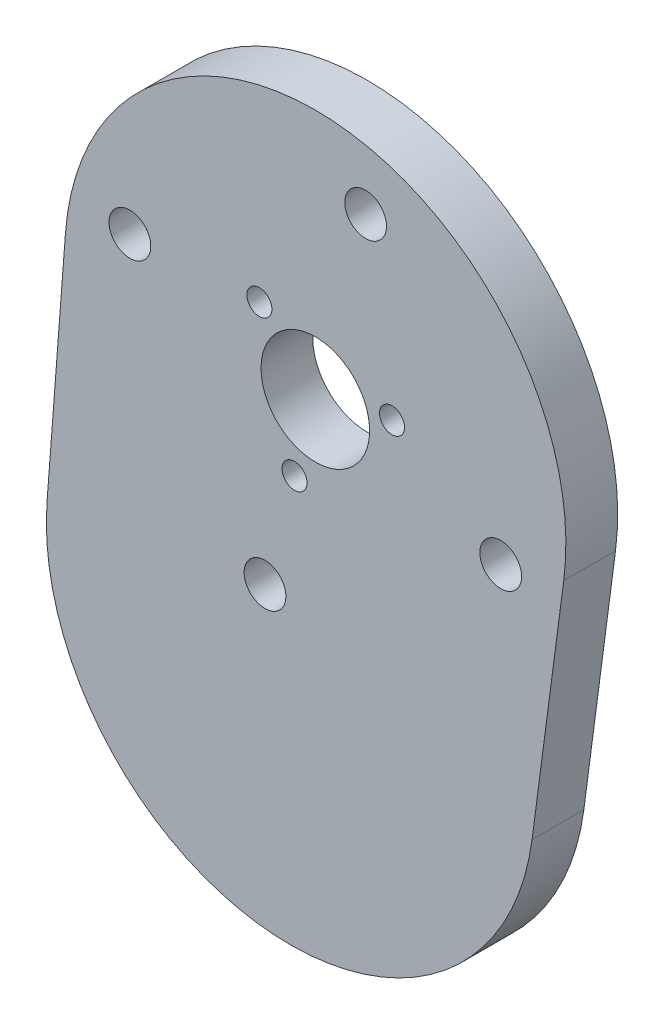
ISO-10303-21;
HEADER;
FILE_DESCRIPTION(('STEP AP214'),'2;1');
FILE_NAME('part.step','',(''),(''),'','','');
FILE_SCHEMA(('AUTOMOTIVE_DESIGN { 1 0 10303 214 1 1 1 1 }'));
ENDSEC;
DATA;
#1=APPLICATION_CONTEXT('core data for automotive mechanical design processes');
#2=APPLICATION_PROTOCOL_DEFINITION('international standard','automotive_design',2000,#1);
#3=PRODUCT_CONTEXT('',#1,'mechanical');
#4=PRODUCT('Part','Part','',(#3));
#5=PRODUCT_RELATED_PRODUCT_CATEGORY('part','',(#4));
#6=PRODUCT_DEFINITION_FORMATION('','',#4);
#7=PRODUCT_DEFINITION_CONTEXT('part definition',#1,'design');
#8=PRODUCT_DEFINITION('design','',#6,#7);
#9=PRODUCT_DEFINITION_SHAPE('','',#8);
#10=(LENGTH_UNIT() NAMED_UNIT(*) SI_UNIT(.MILLI.,.METRE.));
#11=(NAMED_UNIT(*) PLANE_ANGLE_UNIT() SI_UNIT($,.RADIAN.));
#12=(NAMED_UNIT(*) SI_UNIT($,.STERADIAN.) SOLID_ANGLE_UNIT());
#13=UNCERTAINTY_MEASURE_WITH_UNIT(LENGTH_MEASURE(1.E-05),#10,'distance_accuracy_value','');
#14=(GEOMETRIC_REPRESENTATION_CONTEXT(3) GLOBAL_UNCERTAINTY_ASSIGNED_CONTEXT((#13)) GLOBAL_UNIT_ASSIGNED_CONTEXT((#10,
#11,#12)) REPRESENTATION_CONTEXT('',''));
#15=CARTESIAN_POINT('',(0.,0.,0.));
#16=DIRECTION('',(0.,0.,1.));
#17=DIRECTION('',(1.,0.,0.));
#18=AXIS2_PLACEMENT_3D('',#15,#16,#17);
#19=CARTESIAN_POINT('',(29.7420767723274,-3.92541326091705,6.2));
#20=DIRECTION('',(-0.99140255907758,0.130847108697235,0.));
#21=DIRECTION('',(-0.130847108697235,-0.99140255907758,0.));
#22=AXIS2_PLACEMENT_3D('',#19,#20,#21);
#23=PLANE('',#22);
#24=DIRECTION('',(0.130847108697235,0.99140255907758,0.));
#25=VECTOR('',#24,1.);
#26=CARTESIAN_POINT('',(29.7420767723274,-3.92541326091705,0.));
#27=LINE('',#26,#25);
#28=CARTESIAN_POINT('',(25.9489547250653,-32.6651457776712,0.));
#29=VERTEX_POINT('',#28);
#30=CARTESIAN_POINT('',(29.7420767723274,-3.92541326091706,0.));
#31=VERTEX_POINT('',#30);
#32=EDGE_CURVE('E114',#29,#31,#27,.T.);
#33=ORIENTED_EDGE('',*,*,#32,.T.);
#34=DIRECTION('',(0.,0.,-1.));
#35=VECTOR('',#34,1.);
#36=CARTESIAN_POINT('',(29.7420767723274,-3.92541326091706,6.2));
#37=LINE('',#36,#35);
#38=CARTESIAN_POINT('',(29.7420767723274,-3.92541326091706,6.2));
#39=VERTEX_POINT('',#38);
#40=EDGE_CURVE('E11',#39,#31,#37,.T.);
#41=ORIENTED_EDGE('',*,*,#40,.F.);
#42=DIRECTION('',(0.130847108697235,0.99140255907758,0.));
#43=VECTOR('',#42,1.);
#44=CARTESIAN_POINT('',(29.7420767723274,-3.92541326091705,6.2));
#45=LINE('',#44,#43);
#46=CARTESIAN_POINT('',(25.9489547250653,-32.6651457776712,6.2));
#47=VERTEX_POINT('',#46);
#48=EDGE_CURVE('E86',#47,#39,#45,.T.);
#49=ORIENTED_EDGE('',*,*,#48,.F.);
#50=DIRECTION('',(0.,0.,-1.));
#51=VECTOR('',#50,1.);
#52=CARTESIAN_POINT('',(25.9489547250653,-32.6651457776712,6.2));
#53=LINE('',#52,#51);
#54=EDGE_CURVE('E94',#47,#29,#53,.T.);
#55=ORIENTED_EDGE('',*,*,#54,.T.);
#56=EDGE_LOOP('',(#33,#41,#49,#55));
#57=FACE_BOUND('',#56,.T.);
#58=ADVANCED_FACE('F34',(#57),#23,.F.);
#59=CARTESIAN_POINT('',(0.,0.,6.2));
#60=DIRECTION('',(0.,0.,-1.));
#61=DIRECTION('',(-1.,0.,0.));
#62=AXIS2_PLACEMENT_3D('',#59,#60,#61);
#63=CYLINDRICAL_SURFACE('',#62,30.);
#64=CARTESIAN_POINT('',(0.,0.,0.));
#65=DIRECTION('',(0.,0.,1.));
#66=DIRECTION('',(1.,0.,0.));
#67=AXIS2_PLACEMENT_3D('',#64,#65,#66);
#68=CIRCLE('',#67,30.);
#69=CARTESIAN_POINT('',(-29.9133015047887,2.27912112087167,0.));
#70=VERTEX_POINT('',#69);
#71=EDGE_CURVE('E90',#31,#70,#68,.T.);
#72=ORIENTED_EDGE('',*,*,#71,.T.);
#73=DIRECTION('',(0.,0.,-1.));
#74=VECTOR('',#73,1.);
#75=CARTESIAN_POINT('',(-29.9133015047887,2.27912112087167,6.2));
#76=LINE('',#75,#74);
#77=CARTESIAN_POINT('',(-29.9133015047887,2.27912112087167,6.2));
#78=VERTEX_POINT('',#77);
#79=EDGE_CURVE('E43',#78,#70,#76,.T.);
#80=ORIENTED_EDGE('',*,*,#79,.F.);
#81=CARTESIAN_POINT('',(0.,0.,6.2));
#82=DIRECTION('',(0.,0.,1.));
#83=DIRECTION('',(1.,0.,0.));
#84=AXIS2_PLACEMENT_3D('',#81,#82,#83);
#85=CIRCLE('',#84,30.);
#86=EDGE_CURVE('E81',#39,#78,#85,.T.);
#87=ORIENTED_EDGE('',*,*,#86,.F.);
#88=ORIENTED_EDGE('',*,*,#40,.T.);
#89=EDGE_LOOP('',(#72,#80,#87,#88));
#90=FACE_BOUND('',#89,.T.);
#91=ADVANCED_FACE('F89',(#90),#63,.T.);
#92=CARTESIAN_POINT('',(-29.9133015047887,2.27912112087167,6.2));
#93=DIRECTION('',(0.997110050159625,-0.0759707040290557,0.));
#94=DIRECTION('',(0.0759707040290557,0.997110050159625,0.));
#95=AXIS2_PLACEMENT_3D('',#92,#93,#94);
#96=PLANE('',#95);
#97=DIRECTION('',(-0.0759707040290557,-0.997110050159625,0.));
#98=VECTOR('',#97,1.);
#99=CARTESIAN_POINT('',(-29.9133015047887,2.27912112087167,0.));
#100=LINE('',#99,#98);
#101=CARTESIAN_POINT('',(-32.115613464661,-26.6260656460635,0.));
#102=VERTEX_POINT('',#101);
#103=EDGE_CURVE('E68',#70,#102,#100,.T.);
#104=ORIENTED_EDGE('',*,*,#103,.T.);
#105=DIRECTION('',(0.,0.,-1.));
#106=VECTOR('',#105,1.);
#107=CARTESIAN_POINT('',(-32.115613464661,-26.6260656460635,6.2));
#108=LINE('',#107,#106);
#109=CARTESIAN_POINT('',(-32.115613464661,-26.6260656460635,6.2));
#110=VERTEX_POINT('',#109);
#111=EDGE_CURVE('E91',#110,#102,#108,.T.);
#112=ORIENTED_EDGE('',*,*,#111,.F.);
#113=DIRECTION('',(-0.0759707040290557,-0.997110050159625,0.));
#114=VECTOR('',#113,1.);
#115=CARTESIAN_POINT('',(-29.9133015047887,2.27912112087167,6.2));
#116=LINE('',#115,#114);
#117=EDGE_CURVE('E84',#78,#110,#116,.T.);
#118=ORIENTED_EDGE('',*,*,#117,.F.);
#119=ORIENTED_EDGE('',*,*,#79,.T.);
#120=EDGE_LOOP('',(#104,#112,#118,#119));
#121=FACE_BOUND('',#120,.T.);
#122=ADVANCED_FACE('F92',(#121),#96,.F.);
#123=CARTESIAN_POINT('',(0.,0.,6.2));
#124=DIRECTION('',(0.,0.,-1.));
#125=DIRECTION('',(-1.,0.,0.));
#126=AXIS2_PLACEMENT_3D('',#123,#124,#125);
#127=CYLINDRICAL_SURFACE('',#126,6.5);
#128=CARTESIAN_POINT('',(0.,0.,6.2));
#129=DIRECTION('',(0.,0.,1.));
#130=DIRECTION('',(1.,0.,0.));
#131=AXIS2_PLACEMENT_3D('',#128,#129,#130);
#132=CIRCLE('',#131,6.5);
#133=CARTESIAN_POINT('',(-6.5,0.,6.2));
#134=VERTEX_POINT('',#133);
#135=EDGE_CURVE('E127',#134,#134,#132,.T.);
#136=CARTESIAN_POINT('',(0.,0.,0.));
#137=DIRECTION('',(0.,0.,1.));
#138=DIRECTION('',(1.,0.,0.));
#139=AXIS2_PLACEMENT_3D('',#136,#137,#138);
#140=CIRCLE('',#139,6.5);
#141=CARTESIAN_POINT('',(-6.5,0.,0.));
#142=VERTEX_POINT('',#141);
#143=EDGE_CURVE('E111',#142,#142,#140,.T.);
#144=CARTESIAN_POINT('',(-6.5,0.,6.2));
#145=CARTESIAN_POINT('',(-6.5,0.,6.13541666666667));
#146=CARTESIAN_POINT('',(-6.5,0.,6.07083333333333));
#147=CARTESIAN_POINT('',(-6.5,0.,5.94166666666667));
#148=CARTESIAN_POINT('',(-6.5,0.,5.87708333333333));
#149=CARTESIAN_POINT('',(-6.5,0.,5.74791666666667));
#150=CARTESIAN_POINT('',(-6.5,0.,5.68333333333333));
#151=CARTESIAN_POINT('',(-6.5,0.,5.55416666666667));
#152=CARTESIAN_POINT('',(-6.5,0.,5.48958333333333));
#153=CARTESIAN_POINT('',(-6.5,0.,5.36041666666667));
#154=CARTESIAN_POINT('',(-6.5,0.,5.29583333333333));
#155=CARTESIAN_POINT('',(-6.5,0.,5.16666666666667));
#156=CARTESIAN_POINT('',(-6.5,0.,5.10208333333333));
#157=CARTESIAN_POINT('',(-6.5,0.,4.97291666666667));
#158=CARTESIAN_POINT('',(-6.5,0.,4.90833333333333));
#159=CARTESIAN_POINT('',(-6.5,0.,4.77916666666667));
#160=CARTESIAN_POINT('',(-6.5,0.,4.71458333333333));
#161=CARTESIAN_POINT('',(-6.5,0.,4.58541666666667));
#162=CARTESIAN_POINT('',(-6.5,0.,4.52083333333333));
#163=CARTESIAN_POINT('',(-6.5,0.,4.39166666666667));
#164=CARTESIAN_POINT('',(-6.5,0.,4.32708333333333));
#165=CARTESIAN_POINT('',(-6.5,0.,4.19791666666667));
#166=CARTESIAN_POINT('',(-6.5,0.,4.13333333333333));
#167=CARTESIAN_POINT('',(-6.5,0.,4.00416666666667));
#168=CARTESIAN_POINT('',(-6.5,0.,3.93958333333333));
#169=CARTESIAN_POINT('',(-6.5,0.,3.81041666666667));
#170=CARTESIAN_POINT('',(-6.5,0.,3.74583333333333));
#171=CARTESIAN_POINT('',(-6.5,0.,3.61666666666667));
#172=CARTESIAN_POINT('',(-6.5,0.,3.55208333333333));
#173=CARTESIAN_POINT('',(-6.5,0.,3.42291666666667));
#174=CARTESIAN_POINT('',(-6.5,0.,3.35833333333333));
#175=CARTESIAN_POINT('',(-6.5,0.,3.22916666666667));
#176=CARTESIAN_POINT('',(-6.5,0.,3.16458333333333));
#177=CARTESIAN_POINT('',(-6.5,0.,3.03541666666667));
#178=CARTESIAN_POINT('',(-6.5,0.,2.97083333333333));
#179=CARTESIAN_POINT('',(-6.5,0.,2.84166666666667));
#180=CARTESIAN_POINT('',(-6.5,0.,2.77708333333333));
#181=CARTESIAN_POINT('',(-6.5,0.,2.64791666666667));
#182=CARTESIAN_POINT('',(-6.5,0.,2.58333333333333));
#183=CARTESIAN_POINT('',(-6.5,0.,2.45416666666667));
#184=CARTESIAN_POINT('',(-6.5,0.,2.38958333333333));
#185=CARTESIAN_POINT('',(-6.5,0.,2.26041666666667));
#186=CARTESIAN_POINT('',(-6.5,0.,2.19583333333333));
#187=CARTESIAN_POINT('',(-6.5,0.,2.06666666666667));
#188=CARTESIAN_POINT('',(-6.5,0.,2.00208333333333));
#189=CARTESIAN_POINT('',(-6.5,0.,1.87291666666667));
#190=CARTESIAN_POINT('',(-6.5,0.,1.80833333333333));
#191=CARTESIAN_POINT('',(-6.5,0.,1.67916666666667));
#192=CARTESIAN_POINT('',(-6.5,0.,1.61458333333333));
#193=CARTESIAN_POINT('',(-6.5,0.,1.48541666666667));
#194=CARTESIAN_POINT('',(-6.5,0.,1.42083333333333));
#195=CARTESIAN_POINT('',(-6.5,0.,1.29166666666667));
#196=CARTESIAN_POINT('',(-6.5,0.,1.22708333333333));
#197=CARTESIAN_POINT('',(-6.5,0.,1.09791666666667));
#198=CARTESIAN_POINT('',(-6.5,0.,1.03333333333333));
#199=CARTESIAN_POINT('',(-6.5,0.,0.904166666666667));
#200=CARTESIAN_POINT('',(-6.5,0.,0.839583333333333));
#201=CARTESIAN_POINT('',(-6.5,0.,0.710416666666666));
#202=CARTESIAN_POINT('',(-6.5,0.,0.645833333333333));
#203=CARTESIAN_POINT('',(-6.5,0.,0.516666666666667));
#204=CARTESIAN_POINT('',(-6.5,0.,0.452083333333333));
#205=CARTESIAN_POINT('',(-6.5,0.,0.322916666666667));
#206=CARTESIAN_POINT('',(-6.5,0.,0.258333333333334));
#207=CARTESIAN_POINT('',(-6.5,0.,0.129166666666667));
#208=CARTESIAN_POINT('',(-6.5,0.,0.0645833333333335));
#209=CARTESIAN_POINT('',(-6.5,0.,0.));
#210=B_SPLINE_CURVE_WITH_KNOTS('',3,(#144,#145,#146,#147,#148,#149,#150,#151,#152,#153,#154,
#155,#156,#157,#158,#159,#160,#161,#162,#163,#164,#165,#166,#167,#168,#169,#170,#171,#172,#173,
#174,#175,#176,#177,#178,#179,#180,#181,#182,#183,#184,#185,#186,#187,#188,#189,#190,#191,#192,
#193,#194,#195,#196,#197,#198,#199,#200,#201,#202,#203,#204,#205,#206,#207,#208,#209),
.UNSPECIFIED.,.F.,.F.,(4,2,2,2,2,2,2,2,2,2,2,2,2,2,2,2,2,2,2,2,2,2,2,2,2,2,2,2,2,2,2,2,4),(0.,
0.193749999999999,0.3875,0.581249999999999,0.775,0.968749999999999,1.1625,1.35625,1.55,1.74375,
1.9375,2.13125,2.325,2.51875,2.7125,2.90625,3.1,3.29375,3.4875,3.68125,3.875,4.06875,4.2625,
4.45625,4.65,4.84375,5.0375,5.23125,5.425,5.61875,5.8125,6.00625,6.2),.UNSPECIFIED.);
#211=EDGE_CURVE('BSEAM180',#134,#142,#210,.T.);
#212=ORIENTED_EDGE('',*,*,#135,.T.);
#213=ORIENTED_EDGE('',*,*,#143,.F.);
#214=ORIENTED_EDGE('',*,*,#211,.T.);
#215=ORIENTED_EDGE('',*,*,#211,.F.);
#216=EDGE_LOOP('',(#212,#214,#213,#215));
#217=FACE_BOUND('',#216,.T.);
#218=ADVANCED_FACE('F180',(#217),#127,.F.);
#219=CARTESIAN_POINT('',(-6.02438579438068,-22.1969992521616,6.2));
#220=DIRECTION('',(0.,0.,-1.));
#221=DIRECTION('',(-1.,0.,0.));
#222=AXIS2_PLACEMENT_3D('',#219,#220,#221);
#223=CYLINDRICAL_SURFACE('',#222,2.5);
#224=CARTESIAN_POINT('',(-6.02438579438068,-22.1969992521616,6.2));
#225=DIRECTION('',(0.,0.,1.));
#226=DIRECTION('',(1.,0.,0.));
#227=AXIS2_PLACEMENT_3D('',#224,#225,#226);
#228=CIRCLE('',#227,2.5);
#229=CARTESIAN_POINT('',(-8.52438579438068,-22.1969992521616,6.2));
#230=VERTEX_POINT('',#229);
#231=EDGE_CURVE('E129',#230,#230,#228,.T.);
#232=CARTESIAN_POINT('',(-6.02438579438068,-22.1969992521616,0.));
#233=DIRECTION('',(0.,0.,1.));
#234=DIRECTION('',(1.,0.,0.));
#235=AXIS2_PLACEMENT_3D('',#232,#233,#234);
#236=CIRCLE('',#235,2.5);
#237=CARTESIAN_POINT('',(-8.52438579438068,-22.1969992521616,0.));
#238=VERTEX_POINT('',#237);
#239=EDGE_CURVE('E108',#238,#238,#236,.T.);
#240=CARTESIAN_POINT('',(-8.52438579438068,-22.1969992521616,6.2));
#241=CARTESIAN_POINT('',(-8.52438579438068,-22.1969992521616,6.13541666666667));
#242=CARTESIAN_POINT('',(-8.52438579438068,-22.1969992521616,6.07083333333333));
#243=CARTESIAN_POINT('',(-8.52438579438068,-22.1969992521616,5.94166666666667));
#244=CARTESIAN_POINT('',(-8.52438579438068,-22.1969992521616,5.87708333333333));
#245=CARTESIAN_POINT('',(-8.52438579438068,-22.1969992521616,5.74791666666667));
#246=CARTESIAN_POINT('',(-8.52438579438068,-22.1969992521616,5.68333333333333));
#247=CARTESIAN_POINT('',(-8.52438579438068,-22.1969992521616,5.55416666666667));
#248=CARTESIAN_POINT('',(-8.52438579438068,-22.1969992521616,5.48958333333333));
#249=CARTESIAN_POINT('',(-8.52438579438068,-22.1969992521616,5.36041666666667));
#250=CARTESIAN_POINT('',(-8.52438579438068,-22.1969992521616,5.29583333333333));
#251=CARTESIAN_POINT('',(-8.52438579438068,-22.1969992521616,5.16666666666667));
#252=CARTESIAN_POINT('',(-8.52438579438068,-22.1969992521616,5.10208333333333));
#253=CARTESIAN_POINT('',(-8.52438579438068,-22.1969992521616,4.97291666666667));
#254=CARTESIAN_POINT('',(-8.52438579438068,-22.1969992521616,4.90833333333333));
#255=CARTESIAN_POINT('',(-8.52438579438068,-22.1969992521616,4.77916666666667));
#256=CARTESIAN_POINT('',(-8.52438579438068,-22.1969992521616,4.71458333333333));
#257=CARTESIAN_POINT('',(-8.52438579438068,-22.1969992521616,4.58541666666667));
#258=CARTESIAN_POINT('',(-8.52438579438068,-22.1969992521616,4.52083333333333));
#259=CARTESIAN_POINT('',(-8.52438579438068,-22.1969992521616,4.39166666666667));
#260=CARTESIAN_POINT('',(-8.52438579438068,-22.1969992521616,4.32708333333333));
#261=CARTESIAN_POINT('',(-8.52438579438068,-22.1969992521616,4.19791666666667));
#262=CARTESIAN_POINT('',(-8.52438579438068,-22.1969992521616,4.13333333333333));
#263=CARTESIAN_POINT('',(-8.52438579438068,-22.1969992521616,4.00416666666667));
#264=CARTESIAN_POINT('',(-8.52438579438068,-22.1969992521616,3.93958333333333));
#265=CARTESIAN_POINT('',(-8.52438579438068,-22.1969992521616,3.81041666666667));
#266=CARTESIAN_POINT('',(-8.52438579438068,-22.1969992521616,3.74583333333333));
#267=CARTESIAN_POINT('',(-8.52438579438068,-22.1969992521616,3.61666666666667));
#268=CARTESIAN_POINT('',(-8.52438579438068,-22.1969992521616,3.55208333333333));
#269=CARTESIAN_POINT('',(-8.52438579438068,-22.1969992521616,3.42291666666667));
#270=CARTESIAN_POINT('',(-8.52438579438068,-22.1969992521616,3.35833333333333));
#271=CARTESIAN_POINT('',(-8.52438579438068,-22.1969992521616,3.22916666666667));
#272=CARTESIAN_POINT('',(-8.52438579438068,-22.1969992521616,3.16458333333333));
#273=CARTESIAN_POINT('',(-8.52438579438068,-22.1969992521616,3.03541666666667));
#274=CARTESIAN_POINT('',(-8.52438579438068,-22.1969992521616,2.97083333333333));
#275=CARTESIAN_POINT('',(-8.52438579438068,-22.1969992521616,2.84166666666667));
#276=CARTESIAN_POINT('',(-8.52438579438068,-22.1969992521616,2.77708333333333));
#277=CARTESIAN_POINT('',(-8.52438579438068,-22.1969992521616,2.64791666666667));
#278=CARTESIAN_POINT('',(-8.52438579438068,-22.1969992521616,2.58333333333333));
#279=CARTESIAN_POINT('',(-8.52438579438068,-22.1969992521616,2.45416666666667));
#280=CARTESIAN_POINT('',(-8.52438579438068,-22.1969992521616,2.38958333333333));
#281=CARTESIAN_POINT('',(-8.52438579438068,-22.1969992521616,2.26041666666667));
#282=CARTESIAN_POINT('',(-8.52438579438068,-22.1969992521616,2.19583333333333));
#283=CARTESIAN_POINT('',(-8.52438579438068,-22.1969992521616,2.06666666666667));
#284=CARTESIAN_POINT('',(-8.52438579438068,-22.1969992521616,2.00208333333333));
#285=CARTESIAN_POINT('',(-8.52438579438068,-22.1969992521616,1.87291666666667));
#286=CARTESIAN_POINT('',(-8.52438579438068,-22.1969992521616,1.80833333333333));
#287=CARTESIAN_POINT('',(-8.52438579438068,-22.1969992521616,1.67916666666667));
#288=CARTESIAN_POINT('',(-8.52438579438068,-22.1969992521616,1.61458333333333));
#289=CARTESIAN_POINT('',(-8.52438579438068,-22.1969992521616,1.48541666666667));
#290=CARTESIAN_POINT('',(-8.52438579438068,-22.1969992521616,1.42083333333333));
#291=CARTESIAN_POINT('',(-8.52438579438068,-22.1969992521616,1.29166666666667));
#292=CARTESIAN_POINT('',(-8.52438579438068,-22.1969992521616,1.22708333333333));
#293=CARTESIAN_POINT('',(-8.52438579438068,-22.1969992521616,1.09791666666667));
#294=CARTESIAN_POINT('',(-8.52438579438068,-22.1969992521616,1.03333333333333));
#295=CARTESIAN_POINT('',(-8.52438579438068,-22.1969992521616,0.904166666666667));
#296=CARTESIAN_POINT('',(-8.52438579438068,-22.1969992521616,0.839583333333333));
#297=CARTESIAN_POINT('',(-8.52438579438068,-22.1969992521616,0.710416666666666));
#298=CARTESIAN_POINT('',(-8.52438579438068,-22.1969992521616,0.645833333333333));
#299=CARTESIAN_POINT('',(-8.52438579438068,-22.1969992521616,0.516666666666667));
#300=CARTESIAN_POINT('',(-8.52438579438068,-22.1969992521616,0.452083333333333));
#301=CARTESIAN_POINT('',(-8.52438579438068,-22.1969992521616,0.322916666666667));
#302=CARTESIAN_POINT('',(-8.52438579438068,-22.1969992521616,0.258333333333334));
#303=CARTESIAN_POINT('',(-8.52438579438068,-22.1969992521616,0.129166666666667));
#304=CARTESIAN_POINT('',(-8.52438579438068,-22.1969992521616,0.0645833333333335));
#305=CARTESIAN_POINT('',(-8.52438579438068,-22.1969992521616,0.));
#306=B_SPLINE_CURVE_WITH_KNOTS('',3,(#240,#241,#242,#243,#244,#245,#246,#247,#248,#249,#250,
#251,#252,#253,#254,#255,#256,#257,#258,#259,#260,#261,#262,#263,#264,#265,#266,#267,#268,#269,
#270,#271,#272,#273,#274,#275,#276,#277,#278,#279,#280,#281,#282,#283,#284,#285,#286,#287,#288,
#289,#290,#291,#292,#293,#294,#295,#296,#297,#298,#299,#300,#301,#302,#303,#304,#305),
.UNSPECIFIED.,.F.,.F.,(4,2,2,2,2,2,2,2,2,2,2,2,2,2,2,2,2,2,2,2,2,2,2,2,2,2,2,2,2,2,2,2,4),(0.,
0.193749999999999,0.3875,0.581249999999999,0.775,0.968749999999999,1.1625,1.35625,1.55,1.74375,
1.9375,2.13125,2.325,2.51875,2.7125,2.90625,3.1,3.29375,3.4875,3.68125,3.875,4.06875,4.2625,
4.45625,4.65,4.84375,5.0375,5.23125,5.425,5.61875,5.8125,6.00625,6.2),.UNSPECIFIED.);
#307=EDGE_CURVE('BSEAM183',#230,#238,#306,.T.);
#308=ORIENTED_EDGE('',*,*,#231,.T.);
#309=ORIENTED_EDGE('',*,*,#239,.F.);
#310=ORIENTED_EDGE('',*,*,#307,.T.);
#311=ORIENTED_EDGE('',*,*,#307,.F.);
#312=EDGE_LOOP('',(#308,#310,#309,#311));
#313=FACE_BOUND('',#312,.T.);
#314=ADVANCED_FACE('F183',(#313),#223,.F.);
#315=CARTESIAN_POINT('',(6.02438579437938,22.1969992521624,6.2));
#316=DIRECTION('',(0.,0.,-1.));
#317=DIRECTION('',(-1.,0.,0.));
#318=AXIS2_PLACEMENT_3D('',#315,#316,#317);
#319=CYLINDRICAL_SURFACE('',#318,2.49999999999791);
#320=CARTESIAN_POINT('',(6.02438579437938,22.1969992521624,6.2));
#321=DIRECTION('',(0.,0.,1.));
#322=DIRECTION('',(1.,0.,0.));
#323=AXIS2_PLACEMENT_3D('',#320,#321,#322);
#324=CIRCLE('',#323,2.49999999999791);
#325=CARTESIAN_POINT('',(3.52438579438147,22.1969992521624,6.2));
#326=VERTEX_POINT('',#325);
#327=EDGE_CURVE('E134',#326,#326,#324,.T.);
#328=CARTESIAN_POINT('',(6.02438579437938,22.1969992521624,0.));
#329=DIRECTION('',(0.,0.,1.));
#330=DIRECTION('',(1.,0.,0.));
#331=AXIS2_PLACEMENT_3D('',#328,#329,#330);
#332=CIRCLE('',#331,2.49999999999791);
#333=CARTESIAN_POINT('',(3.52438579438147,22.1969992521624,0.));
#334=VERTEX_POINT('',#333);
#335=EDGE_CURVE('E105',#334,#334,#332,.T.);
#336=CARTESIAN_POINT('',(3.52438579438147,22.1969992521624,6.2));
#337=CARTESIAN_POINT('',(3.52438579438147,22.1969992521624,6.13541666666667));
#338=CARTESIAN_POINT('',(3.52438579438147,22.1969992521624,6.07083333333333));
#339=CARTESIAN_POINT('',(3.52438579438147,22.1969992521624,5.94166666666667));
#340=CARTESIAN_POINT('',(3.52438579438147,22.1969992521624,5.87708333333333));
#341=CARTESIAN_POINT('',(3.52438579438147,22.1969992521624,5.74791666666667));
#342=CARTESIAN_POINT('',(3.52438579438147,22.1969992521624,5.68333333333333));
#343=CARTESIAN_POINT('',(3.52438579438147,22.1969992521624,5.55416666666667));
#344=CARTESIAN_POINT('',(3.52438579438147,22.1969992521624,5.48958333333333));
#345=CARTESIAN_POINT('',(3.52438579438147,22.1969992521624,5.36041666666667));
#346=CARTESIAN_POINT('',(3.52438579438147,22.1969992521624,5.29583333333333));
#347=CARTESIAN_POINT('',(3.52438579438147,22.1969992521624,5.16666666666667));
#348=CARTESIAN_POINT('',(3.52438579438147,22.1969992521624,5.10208333333333));
#349=CARTESIAN_POINT('',(3.52438579438147,22.1969992521624,4.97291666666667));
#350=CARTESIAN_POINT('',(3.52438579438147,22.1969992521624,4.90833333333333));
#351=CARTESIAN_POINT('',(3.52438579438147,22.1969992521624,4.77916666666667));
#352=CARTESIAN_POINT('',(3.52438579438147,22.1969992521624,4.71458333333333));
#353=CARTESIAN_POINT('',(3.52438579438147,22.1969992521624,4.58541666666667));
#354=CARTESIAN_POINT('',(3.52438579438147,22.1969992521624,4.52083333333333));
#355=CARTESIAN_POINT('',(3.52438579438147,22.1969992521624,4.39166666666667));
#356=CARTESIAN_POINT('',(3.52438579438147,22.1969992521624,4.32708333333333));
#357=CARTESIAN_POINT('',(3.52438579438147,22.1969992521624,4.19791666666667));
#358=CARTESIAN_POINT('',(3.52438579438147,22.1969992521624,4.13333333333333));
#359=CARTESIAN_POINT('',(3.52438579438147,22.1969992521624,4.00416666666667));
#360=CARTESIAN_POINT('',(3.52438579438147,22.1969992521624,3.93958333333333));
#361=CARTESIAN_POINT('',(3.52438579438147,22.1969992521624,3.81041666666667));
#362=CARTESIAN_POINT('',(3.52438579438147,22.1969992521624,3.74583333333333));
#363=CARTESIAN_POINT('',(3.52438579438147,22.1969992521624,3.61666666666667));
#364=CARTESIAN_POINT('',(3.52438579438147,22.1969992521624,3.55208333333333));
#365=CARTESIAN_POINT('',(3.52438579438147,22.1969992521624,3.42291666666667));
#366=CARTESIAN_POINT('',(3.52438579438147,22.1969992521624,3.35833333333333));
#367=CARTESIAN_POINT('',(3.52438579438147,22.1969992521624,3.22916666666667));
#368=CARTESIAN_POINT('',(3.52438579438147,22.1969992521624,3.16458333333333));
#369=CARTESIAN_POINT('',(3.52438579438147,22.1969992521624,3.03541666666667));
#370=CARTESIAN_POINT('',(3.52438579438147,22.1969992521624,2.97083333333333));
#371=CARTESIAN_POINT('',(3.52438579438147,22.1969992521624,2.84166666666667));
#372=CARTESIAN_POINT('',(3.52438579438147,22.1969992521624,2.77708333333333));
#373=CARTESIAN_POINT('',(3.52438579438147,22.1969992521624,2.64791666666667));
#374=CARTESIAN_POINT('',(3.52438579438147,22.1969992521624,2.58333333333333));
#375=CARTESIAN_POINT('',(3.52438579438147,22.1969992521624,2.45416666666667));
#376=CARTESIAN_POINT('',(3.52438579438147,22.1969992521624,2.38958333333333));
#377=CARTESIAN_POINT('',(3.52438579438147,22.1969992521624,2.26041666666667));
#378=CARTESIAN_POINT('',(3.52438579438147,22.1969992521624,2.19583333333333));
#379=CARTESIAN_POINT('',(3.52438579438147,22.1969992521624,2.06666666666667));
#380=CARTESIAN_POINT('',(3.52438579438147,22.1969992521624,2.00208333333333));
#381=CARTESIAN_POINT('',(3.52438579438147,22.1969992521624,1.87291666666667));
#382=CARTESIAN_POINT('',(3.52438579438147,22.1969992521624,1.80833333333333));
#383=CARTESIAN_POINT('',(3.52438579438147,22.1969992521624,1.67916666666667));
#384=CARTESIAN_POINT('',(3.52438579438147,22.1969992521624,1.61458333333333));
#385=CARTESIAN_POINT('',(3.52438579438147,22.1969992521624,1.48541666666667));
#386=CARTESIAN_POINT('',(3.52438579438147,22.1969992521624,1.42083333333333));
#387=CARTESIAN_POINT('',(3.52438579438147,22.1969992521624,1.29166666666667));
#388=CARTESIAN_POINT('',(3.52438579438147,22.1969992521624,1.22708333333333));
#389=CARTESIAN_POINT('',(3.52438579438147,22.1969992521624,1.09791666666667));
#390=CARTESIAN_POINT('',(3.52438579438147,22.1969992521624,1.03333333333333));
#391=CARTESIAN_POINT('',(3.52438579438147,22.1969992521624,0.904166666666667));
#392=CARTESIAN_POINT('',(3.52438579438147,22.1969992521624,0.839583333333333));
#393=CARTESIAN_POINT('',(3.52438579438147,22.1969992521624,0.710416666666666));
#394=CARTESIAN_POINT('',(3.52438579438147,22.1969992521624,0.645833333333333));
#395=CARTESIAN_POINT('',(3.52438579438147,22.1969992521624,0.516666666666667));
#396=CARTESIAN_POINT('',(3.52438579438147,22.1969992521624,0.452083333333333));
#397=CARTESIAN_POINT('',(3.52438579438147,22.1969992521624,0.322916666666667));
#398=CARTESIAN_POINT('',(3.52438579438147,22.1969992521624,0.258333333333334));
#399=CARTESIAN_POINT('',(3.52438579438147,22.1969992521624,0.129166666666667));
#400=CARTESIAN_POINT('',(3.52438579438147,22.1969992521624,0.0645833333333335));
#401=CARTESIAN_POINT('',(3.52438579438147,22.1969992521624,0.));
#402=B_SPLINE_CURVE_WITH_KNOTS('',3,(#336,#337,#338,#339,#340,#341,#342,#343,#344,#345,#346,
#347,#348,#349,#350,#351,#352,#353,#354,#355,#356,#357,#358,#359,#360,#361,#362,#363,#364,#365,
#366,#367,#368,#369,#370,#371,#372,#373,#374,#375,#376,#377,#378,#379,#380,#381,#382,#383,#384,
#385,#386,#387,#388,#389,#390,#391,#392,#393,#394,#395,#396,#397,#398,#399,#400,#401),
.UNSPECIFIED.,.F.,.F.,(4,2,2,2,2,2,2,2,2,2,2,2,2,2,2,2,2,2,2,2,2,2,2,2,2,2,2,2,2,2,2,2,4),(0.,
0.193749999999999,0.3875,0.581249999999999,0.775,0.968749999999999,1.1625,1.35625,1.55,1.74375,
1.9375,2.13125,2.325,2.51875,2.7125,2.90625,3.1,3.29375,3.4875,3.68125,3.875,4.06875,4.2625,
4.45625,4.65,4.84375,5.0375,5.23125,5.425,5.61875,5.8125,6.00625,6.2),.UNSPECIFIED.);
#403=EDGE_CURVE('BSEAM210',#326,#334,#402,.T.);
#404=ORIENTED_EDGE('',*,*,#327,.T.);
#405=ORIENTED_EDGE('',*,*,#335,.F.);
#406=ORIENTED_EDGE('',*,*,#403,.T.);
#407=ORIENTED_EDGE('',*,*,#403,.F.);
#408=EDGE_LOOP('',(#404,#406,#405,#407));
#409=FACE_BOUND('',#408,.T.);
#410=ADVANCED_FACE('F210',(#409),#319,.F.);
#411=CARTESIAN_POINT('',(-22.1969992521627,6.0243857943784,6.2));
#412=DIRECTION('',(0.,0.,-1.));
#413=DIRECTION('',(-1.,0.,0.));
#414=AXIS2_PLACEMENT_3D('',#411,#412,#413);
#415=CYLINDRICAL_SURFACE('',#414,2.5);
#416=CARTESIAN_POINT('',(-22.1969992521627,6.0243857943784,6.2));
#417=DIRECTION('',(0.,0.,1.));
#418=DIRECTION('',(1.,0.,0.));
#419=AXIS2_PLACEMENT_3D('',#416,#417,#418);
#420=CIRCLE('',#419,2.5);
#421=CARTESIAN_POINT('',(-24.6969992521627,6.0243857943784,6.2));
#422=VERTEX_POINT('',#421);
#423=EDGE_CURVE('E137',#422,#422,#420,.T.);
#424=CARTESIAN_POINT('',(-22.1969992521627,6.0243857943784,0.));
#425=DIRECTION('',(0.,0.,1.));
#426=DIRECTION('',(1.,0.,0.));
#427=AXIS2_PLACEMENT_3D('',#424,#425,#426);
#428=CIRCLE('',#427,2.5);
#429=CARTESIAN_POINT('',(-24.6969992521627,6.0243857943784,0.));
#430=VERTEX_POINT('',#429);
#431=EDGE_CURVE('E101',#430,#430,#428,.T.);
#432=CARTESIAN_POINT('',(-24.6969992521627,6.0243857943784,6.2));
#433=CARTESIAN_POINT('',(-24.6969992521627,6.0243857943784,6.13541666666667));
#434=CARTESIAN_POINT('',(-24.6969992521627,6.0243857943784,6.07083333333333));
#435=CARTESIAN_POINT('',(-24.6969992521627,6.0243857943784,5.94166666666667));
#436=CARTESIAN_POINT('',(-24.6969992521627,6.0243857943784,5.87708333333333));
#437=CARTESIAN_POINT('',(-24.6969992521627,6.0243857943784,5.74791666666667));
#438=CARTESIAN_POINT('',(-24.6969992521627,6.0243857943784,5.68333333333333));
#439=CARTESIAN_POINT('',(-24.6969992521627,6.0243857943784,5.55416666666667));
#440=CARTESIAN_POINT('',(-24.6969992521627,6.0243857943784,5.48958333333333));
#441=CARTESIAN_POINT('',(-24.6969992521627,6.0243857943784,5.36041666666667));
#442=CARTESIAN_POINT('',(-24.6969992521627,6.0243857943784,5.29583333333333));
#443=CARTESIAN_POINT('',(-24.6969992521627,6.0243857943784,5.16666666666667));
#444=CARTESIAN_POINT('',(-24.6969992521627,6.0243857943784,5.10208333333333));
#445=CARTESIAN_POINT('',(-24.6969992521627,6.0243857943784,4.97291666666667));
#446=CARTESIAN_POINT('',(-24.6969992521627,6.0243857943784,4.90833333333333));
#447=CARTESIAN_POINT('',(-24.6969992521627,6.0243857943784,4.77916666666667));
#448=CARTESIAN_POINT('',(-24.6969992521627,6.0243857943784,4.71458333333333));
#449=CARTESIAN_POINT('',(-24.6969992521627,6.0243857943784,4.58541666666667));
#450=CARTESIAN_POINT('',(-24.6969992521627,6.0243857943784,4.52083333333333));
#451=CARTESIAN_POINT('',(-24.6969992521627,6.0243857943784,4.39166666666667));
#452=CARTESIAN_POINT('',(-24.6969992521627,6.0243857943784,4.32708333333333));
#453=CARTESIAN_POINT('',(-24.6969992521627,6.0243857943784,4.19791666666667));
#454=CARTESIAN_POINT('',(-24.6969992521627,6.0243857943784,4.13333333333333));
#455=CARTESIAN_POINT('',(-24.6969992521627,6.0243857943784,4.00416666666667));
#456=CARTESIAN_POINT('',(-24.6969992521627,6.0243857943784,3.93958333333333));
#457=CARTESIAN_POINT('',(-24.6969992521627,6.0243857943784,3.81041666666667));
#458=CARTESIAN_POINT('',(-24.6969992521627,6.0243857943784,3.74583333333333));
#459=CARTESIAN_POINT('',(-24.6969992521627,6.0243857943784,3.61666666666667));
#460=CARTESIAN_POINT('',(-24.6969992521627,6.0243857943784,3.55208333333333));
#461=CARTESIAN_POINT('',(-24.6969992521627,6.0243857943784,3.42291666666667));
#462=CARTESIAN_POINT('',(-24.6969992521627,6.0243857943784,3.35833333333333));
#463=CARTESIAN_POINT('',(-24.6969992521627,6.0243857943784,3.22916666666667));
#464=CARTESIAN_POINT('',(-24.6969992521627,6.0243857943784,3.16458333333333));
#465=CARTESIAN_POINT('',(-24.6969992521627,6.0243857943784,3.03541666666667));
#466=CARTESIAN_POINT('',(-24.6969992521627,6.0243857943784,2.97083333333333));
#467=CARTESIAN_POINT('',(-24.6969992521627,6.0243857943784,2.84166666666667));
#468=CARTESIAN_POINT('',(-24.6969992521627,6.0243857943784,2.77708333333333));
#469=CARTESIAN_POINT('',(-24.6969992521627,6.0243857943784,2.64791666666667));
#470=CARTESIAN_POINT('',(-24.6969992521627,6.0243857943784,2.58333333333333));
#471=CARTESIAN_POINT('',(-24.6969992521627,6.0243857943784,2.45416666666667));
#472=CARTESIAN_POINT('',(-24.6969992521627,6.0243857943784,2.38958333333333));
#473=CARTESIAN_POINT('',(-24.6969992521627,6.0243857943784,2.26041666666667));
#474=CARTESIAN_POINT('',(-24.6969992521627,6.0243857943784,2.19583333333333));
#475=CARTESIAN_POINT('',(-24.6969992521627,6.0243857943784,2.06666666666667));
#476=CARTESIAN_POINT('',(-24.6969992521627,6.0243857943784,2.00208333333333));
#477=CARTESIAN_POINT('',(-24.6969992521627,6.0243857943784,1.87291666666667));
#478=CARTESIAN_POINT('',(-24.6969992521627,6.0243857943784,1.80833333333333));
#479=CARTESIAN_POINT('',(-24.6969992521627,6.0243857943784,1.67916666666667));
#480=CARTESIAN_POINT('',(-24.6969992521627,6.0243857943784,1.61458333333333));
#481=CARTESIAN_POINT('',(-24.6969992521627,6.0243857943784,1.48541666666667));
#482=CARTESIAN_POINT('',(-24.6969992521627,6.0243857943784,1.42083333333333));
#483=CARTESIAN_POINT('',(-24.6969992521627,6.0243857943784,1.29166666666667));
#484=CARTESIAN_POINT('',(-24.6969992521627,6.0243857943784,1.22708333333333));
#485=CARTESIAN_POINT('',(-24.6969992521627,6.0243857943784,1.09791666666667));
#486=CARTESIAN_POINT('',(-24.6969992521627,6.0243857943784,1.03333333333333));
#487=CARTESIAN_POINT('',(-24.6969992521627,6.0243857943784,0.904166666666667));
#488=CARTESIAN_POINT('',(-24.6969992521627,6.0243857943784,0.839583333333333));
#489=CARTESIAN_POINT('',(-24.6969992521627,6.0243857943784,0.710416666666666));
#490=CARTESIAN_POINT('',(-24.6969992521627,6.0243857943784,0.645833333333333));
#491=CARTESIAN_POINT('',(-24.6969992521627,6.0243857943784,0.516666666666667));
#492=CARTESIAN_POINT('',(-24.6969992521627,6.0243857943784,0.452083333333333));
#493=CARTESIAN_POINT('',(-24.6969992521627,6.0243857943784,0.322916666666667));
#494=CARTESIAN_POINT('',(-24.6969992521627,6.0243857943784,0.258333333333334));
#495=CARTESIAN_POINT('',(-24.6969992521627,6.0243857943784,0.129166666666667));
#496=CARTESIAN_POINT('',(-24.6969992521627,6.0243857943784,0.0645833333333335));
#497=CARTESIAN_POINT('',(-24.6969992521627,6.0243857943784,0.));
#498=B_SPLINE_CURVE_WITH_KNOTS('',3,(#432,#433,#434,#435,#436,#437,#438,#439,#440,#441,#442,
#443,#444,#445,#446,#447,#448,#449,#450,#451,#452,#453,#454,#455,#456,#457,#458,#459,#460,#461,
#462,#463,#464,#465,#466,#467,#468,#469,#470,#471,#472,#473,#474,#475,#476,#477,#478,#479,#480,
#481,#482,#483,#484,#485,#486,#487,#488,#489,#490,#491,#492,#493,#494,#495,#496,#497),
.UNSPECIFIED.,.F.,.F.,(4,2,2,2,2,2,2,2,2,2,2,2,2,2,2,2,2,2,2,2,2,2,2,2,2,2,2,2,2,2,2,2,4),(0.,
0.193749999999999,0.3875,0.581249999999999,0.775,0.968749999999999,1.1625,1.35625,1.55,1.74375,
1.9375,2.13125,2.325,2.51875,2.7125,2.90625,3.1,3.29375,3.4875,3.68125,3.875,4.06875,4.2625,
4.45625,4.65,4.84375,5.0375,5.23125,5.425,5.61875,5.8125,6.00625,6.2),.UNSPECIFIED.);
#499=EDGE_CURVE('BSEAM213',#422,#430,#498,.T.);
#500=ORIENTED_EDGE('',*,*,#423,.T.);
#501=ORIENTED_EDGE('',*,*,#431,.F.);
#502=ORIENTED_EDGE('',*,*,#499,.T.);
#503=ORIENTED_EDGE('',*,*,#499,.F.);
#504=EDGE_LOOP('',(#500,#502,#501,#503));
#505=FACE_BOUND('',#504,.T.);
#506=ADVANCED_FACE('F213',(#505),#415,.F.);
#507=CARTESIAN_POINT('',(22.1969992521617,-6.02438579438182,6.2));
#508=DIRECTION('',(0.,0.,-1.));
#509=DIRECTION('',(-1.,0.,0.));
#510=AXIS2_PLACEMENT_3D('',#507,#508,#509);
#511=CYLINDRICAL_SURFACE('',#510,2.49999999999877);
#512=CARTESIAN_POINT('',(22.1969992521617,-6.02438579438182,6.2));
#513=DIRECTION('',(0.,0.,1.));
#514=DIRECTION('',(1.,0.,0.));
#515=AXIS2_PLACEMENT_3D('',#512,#513,#514);
#516=CIRCLE('',#515,2.49999999999877);
#517=CARTESIAN_POINT('',(19.696999252163,-6.02438579438182,6.2));
#518=VERTEX_POINT('',#517);
#519=EDGE_CURVE('E120',#518,#518,#516,.T.);
#520=CARTESIAN_POINT('',(22.1969992521617,-6.02438579438182,0.));
#521=DIRECTION('',(0.,0.,1.));
#522=DIRECTION('',(1.,0.,0.));
#523=AXIS2_PLACEMENT_3D('',#520,#521,#522);
#524=CIRCLE('',#523,2.49999999999877);
#525=CARTESIAN_POINT('',(19.696999252163,-6.02438579438182,0.));
#526=VERTEX_POINT('',#525);
#527=EDGE_CURVE('E98',#526,#526,#524,.T.);
#528=CARTESIAN_POINT('',(19.696999252163,-6.02438579438182,6.2));
#529=CARTESIAN_POINT('',(19.696999252163,-6.02438579438182,6.13541666666667));
#530=CARTESIAN_POINT('',(19.696999252163,-6.02438579438182,6.07083333333333));
#531=CARTESIAN_POINT('',(19.696999252163,-6.02438579438182,5.94166666666667));
#532=CARTESIAN_POINT('',(19.696999252163,-6.02438579438182,5.87708333333333));
#533=CARTESIAN_POINT('',(19.696999252163,-6.02438579438182,5.74791666666667));
#534=CARTESIAN_POINT('',(19.696999252163,-6.02438579438182,5.68333333333333));
#535=CARTESIAN_POINT('',(19.696999252163,-6.02438579438182,5.55416666666667));
#536=CARTESIAN_POINT('',(19.696999252163,-6.02438579438182,5.48958333333333));
#537=CARTESIAN_POINT('',(19.696999252163,-6.02438579438182,5.36041666666667));
#538=CARTESIAN_POINT('',(19.696999252163,-6.02438579438182,5.29583333333333));
#539=CARTESIAN_POINT('',(19.696999252163,-6.02438579438182,5.16666666666667));
#540=CARTESIAN_POINT('',(19.696999252163,-6.02438579438182,5.10208333333333));
#541=CARTESIAN_POINT('',(19.696999252163,-6.02438579438182,4.97291666666667));
#542=CARTESIAN_POINT('',(19.696999252163,-6.02438579438182,4.90833333333333));
#543=CARTESIAN_POINT('',(19.696999252163,-6.02438579438182,4.77916666666667));
#544=CARTESIAN_POINT('',(19.696999252163,-6.02438579438182,4.71458333333333));
#545=CARTESIAN_POINT('',(19.696999252163,-6.02438579438182,4.58541666666667));
#546=CARTESIAN_POINT('',(19.696999252163,-6.02438579438182,4.52083333333333));
#547=CARTESIAN_POINT('',(19.696999252163,-6.02438579438182,4.39166666666667));
#548=CARTESIAN_POINT('',(19.696999252163,-6.02438579438182,4.32708333333333));
#549=CARTESIAN_POINT('',(19.696999252163,-6.02438579438182,4.19791666666667));
#550=CARTESIAN_POINT('',(19.696999252163,-6.02438579438182,4.13333333333333));
#551=CARTESIAN_POINT('',(19.696999252163,-6.02438579438182,4.00416666666667));
#552=CARTESIAN_POINT('',(19.696999252163,-6.02438579438182,3.93958333333333));
#553=CARTESIAN_POINT('',(19.696999252163,-6.02438579438182,3.81041666666667));
#554=CARTESIAN_POINT('',(19.696999252163,-6.02438579438182,3.74583333333333));
#555=CARTESIAN_POINT('',(19.696999252163,-6.02438579438182,3.61666666666667));
#556=CARTESIAN_POINT('',(19.696999252163,-6.02438579438182,3.55208333333333));
#557=CARTESIAN_POINT('',(19.696999252163,-6.02438579438182,3.42291666666667));
#558=CARTESIAN_POINT('',(19.696999252163,-6.02438579438182,3.35833333333333));
#559=CARTESIAN_POINT('',(19.696999252163,-6.02438579438182,3.22916666666667));
#560=CARTESIAN_POINT('',(19.696999252163,-6.02438579438182,3.16458333333333));
#561=CARTESIAN_POINT('',(19.696999252163,-6.02438579438182,3.03541666666667));
#562=CARTESIAN_POINT('',(19.696999252163,-6.02438579438182,2.97083333333333));
#563=CARTESIAN_POINT('',(19.696999252163,-6.02438579438182,2.84166666666667));
#564=CARTESIAN_POINT('',(19.696999252163,-6.02438579438182,2.77708333333333));
#565=CARTESIAN_POINT('',(19.696999252163,-6.02438579438182,2.64791666666667));
#566=CARTESIAN_POINT('',(19.696999252163,-6.02438579438182,2.58333333333333));
#567=CARTESIAN_POINT('',(19.696999252163,-6.02438579438182,2.45416666666667));
#568=CARTESIAN_POINT('',(19.696999252163,-6.02438579438182,2.38958333333333));
#569=CARTESIAN_POINT('',(19.696999252163,-6.02438579438182,2.26041666666667));
#570=CARTESIAN_POINT('',(19.696999252163,-6.02438579438182,2.19583333333333));
#571=CARTESIAN_POINT('',(19.696999252163,-6.02438579438182,2.06666666666667));
#572=CARTESIAN_POINT('',(19.696999252163,-6.02438579438182,2.00208333333333));
#573=CARTESIAN_POINT('',(19.696999252163,-6.02438579438182,1.87291666666667));
#574=CARTESIAN_POINT('',(19.696999252163,-6.02438579438182,1.80833333333333));
#575=CARTESIAN_POINT('',(19.696999252163,-6.02438579438182,1.67916666666667));
#576=CARTESIAN_POINT('',(19.696999252163,-6.02438579438182,1.61458333333333));
#577=CARTESIAN_POINT('',(19.696999252163,-6.02438579438182,1.48541666666667));
#578=CARTESIAN_POINT('',(19.696999252163,-6.02438579438182,1.42083333333333));
#579=CARTESIAN_POINT('',(19.696999252163,-6.02438579438182,1.29166666666667));
#580=CARTESIAN_POINT('',(19.696999252163,-6.02438579438182,1.22708333333333));
#581=CARTESIAN_POINT('',(19.696999252163,-6.02438579438182,1.09791666666667));
#582=CARTESIAN_POINT('',(19.696999252163,-6.02438579438182,1.03333333333333));
#583=CARTESIAN_POINT('',(19.696999252163,-6.02438579438182,0.904166666666667));
#584=CARTESIAN_POINT('',(19.696999252163,-6.02438579438182,0.839583333333333));
#585=CARTESIAN_POINT('',(19.696999252163,-6.02438579438182,0.710416666666666));
#586=CARTESIAN_POINT('',(19.696999252163,-6.02438579438182,0.645833333333333));
#587=CARTESIAN_POINT('',(19.696999252163,-6.02438579438182,0.516666666666667));
#588=CARTESIAN_POINT('',(19.696999252163,-6.02438579438182,0.452083333333333));
#589=CARTESIAN_POINT('',(19.696999252163,-6.02438579438182,0.322916666666667));
#590=CARTESIAN_POINT('',(19.696999252163,-6.02438579438182,0.258333333333334));
#591=CARTESIAN_POINT('',(19.696999252163,-6.02438579438182,0.129166666666667));
#592=CARTESIAN_POINT('',(19.696999252163,-6.02438579438182,0.0645833333333335));
#593=CARTESIAN_POINT('',(19.696999252163,-6.02438579438182,0.));
#594=B_SPLINE_CURVE_WITH_KNOTS('',3,(#528,#529,#530,#531,#532,#533,#534,#535,#536,#537,#538,
#539,#540,#541,#542,#543,#544,#545,#546,#547,#548,#549,#550,#551,#552,#553,#554,#555,#556,#557,
#558,#559,#560,#561,#562,#563,#564,#565,#566,#567,#568,#569,#570,#571,#572,#573,#574,#575,#576,
#577,#578,#579,#580,#581,#582,#583,#584,#585,#586,#587,#588,#589,#590,#591,#592,#593),
.UNSPECIFIED.,.F.,.F.,(4,2,2,2,2,2,2,2,2,2,2,2,2,2,2,2,2,2,2,2,2,2,2,2,2,2,2,2,2,2,2,2,4),(0.,
0.193749999999999,0.3875,0.581249999999999,0.775,0.968749999999999,1.1625,1.35625,1.55,1.74375,
1.9375,2.13125,2.325,2.51875,2.7125,2.90625,3.1,3.29375,3.4875,3.68125,3.875,4.06875,4.2625,
4.45625,4.65,4.84375,5.0375,5.23125,5.425,5.61875,5.8125,6.00625,6.2),.UNSPECIFIED.);
#595=EDGE_CURVE('BSEAM36',#518,#526,#594,.T.);
#596=ORIENTED_EDGE('',*,*,#519,.T.);
#597=ORIENTED_EDGE('',*,*,#527,.F.);
#598=ORIENTED_EDGE('',*,*,#595,.T.);
#599=ORIENTED_EDGE('',*,*,#595,.F.);
#600=EDGE_LOOP('',(#596,#598,#597,#599));
#601=FACE_BOUND('',#600,.T.);
#602=ADVANCED_FACE('F36',(#601),#511,.F.);
#603=CARTESIAN_POINT('',(-3.,-28.8444102037119,6.2));
#604=DIRECTION('',(0.,0.,-1.));
#605=DIRECTION('',(-1.,0.,0.));
#606=AXIS2_PLACEMENT_3D('',#603,#604,#605);
#607=CYLINDRICAL_SURFACE('',#606,29.2);
#608=CARTESIAN_POINT('',(-3.,-28.8444102037119,0.));
#609=DIRECTION('',(0.,0.,1.));
#610=DIRECTION('',(1.,0.,0.));
#611=AXIS2_PLACEMENT_3D('',#608,#609,#610);
#612=CIRCLE('',#611,29.2);
#613=EDGE_CURVE('E74',#102,#29,#612,.T.);
#614=ORIENTED_EDGE('',*,*,#613,.T.);
#615=ORIENTED_EDGE('',*,*,#54,.F.);
#616=CARTESIAN_POINT('',(-3.,-28.8444102037119,6.2));
#617=DIRECTION('',(0.,0.,1.));
#618=DIRECTION('',(1.,0.,0.));
#619=AXIS2_PLACEMENT_3D('',#616,#617,#618);
#620=CIRCLE('',#619,29.2);
#621=EDGE_CURVE('E51',#110,#47,#620,.T.);
#622=ORIENTED_EDGE('',*,*,#621,.F.);
#623=ORIENTED_EDGE('',*,*,#111,.T.);
#624=EDGE_LOOP('',(#614,#615,#622,#623));
#625=FACE_BOUND('',#624,.T.);
#626=ADVANCED_FACE('F122',(#625),#607,.T.);
#627=CARTESIAN_POINT('',(0.,0.,6.2));
#628=DIRECTION('',(0.,0.,1.));
#629=DIRECTION('',(1.,0.,0.));
#630=AXIS2_PLACEMENT_3D('',#627,#628,#629);
#631=PLANE('',#630);
#632=CARTESIAN_POINT('',(9.18416966542684,2.42920307028157,6.2));
#633=DIRECTION('',(0.,0.,1.));
#634=DIRECTION('',(1.,0.,0.));
#635=AXIS2_PLACEMENT_3D('',#632,#633,#634);
#636=CIRCLE('',#635,1.5);
#637=CARTESIAN_POINT('',(10.6841696654268,2.42920307028157,6.2));
#638=VERTEX_POINT('',#637);
#639=EDGE_CURVE('E152',#638,#638,#636,.T.);
#640=ORIENTED_EDGE('',*,*,#639,.F.);
#641=EDGE_LOOP('',(#640));
#642=FACE_BOUND('',#641,.T.);
#643=CARTESIAN_POINT('',(-6.69583640252842,6.73912270778349,6.2));
#644=DIRECTION('',(0.,0.,1.));
#645=DIRECTION('',(1.,0.,0.));
#646=AXIS2_PLACEMENT_3D('',#643,#644,#645);
#647=CIRCLE('',#646,1.5);
#648=CARTESIAN_POINT('',(-5.19583640252843,6.73912270778349,6.2));
#649=VERTEX_POINT('',#648);
#650=EDGE_CURVE('E145',#649,#649,#647,.T.);
#651=ORIENTED_EDGE('',*,*,#650,.F.);
#652=EDGE_LOOP('',(#651));
#653=FACE_BOUND('',#652,.T.);
#654=CARTESIAN_POINT('',(-2.48833326289842,-9.16832577806622,6.2));
#655=DIRECTION('',(0.,0.,1.));
#656=DIRECTION('',(1.,0.,0.));
#657=AXIS2_PLACEMENT_3D('',#654,#655,#656);
#658=CIRCLE('',#657,1.5);
#659=CARTESIAN_POINT('',(-0.988333262898418,-9.16832577806622,6.2));
#660=VERTEX_POINT('',#659);
#661=EDGE_CURVE('E146',#660,#660,#658,.T.);
#662=ORIENTED_EDGE('',*,*,#661,.F.);
#663=EDGE_LOOP('',(#662));
#664=FACE_BOUND('',#663,.T.);
#665=ORIENTED_EDGE('',*,*,#519,.F.);
#666=EDGE_LOOP('',(#665));
#667=FACE_BOUND('',#666,.T.);
#668=ORIENTED_EDGE('',*,*,#423,.F.);
#669=EDGE_LOOP('',(#668));
#670=FACE_BOUND('',#669,.T.);
#671=ORIENTED_EDGE('',*,*,#327,.F.);
#672=EDGE_LOOP('',(#671));
#673=FACE_BOUND('',#672,.T.);
#674=ORIENTED_EDGE('',*,*,#231,.F.);
#675=EDGE_LOOP('',(#674));
#676=FACE_BOUND('',#675,.T.);
#677=ORIENTED_EDGE('',*,*,#135,.F.);
#678=EDGE_LOOP('',(#677));
#679=FACE_BOUND('',#678,.T.);
#680=ORIENTED_EDGE('',*,*,#48,.T.);
#681=ORIENTED_EDGE('',*,*,#86,.T.);
#682=ORIENTED_EDGE('',*,*,#117,.T.);
#683=ORIENTED_EDGE('',*,*,#621,.T.);
#684=EDGE_LOOP('',(#680,#681,#682,#683));
#685=FACE_BOUND('',#684,.T.);
#686=ADVANCED_FACE('F82',(#642,#653,#664,#667,#670,#673,#676,#679,#685),#631,.T.);
#687=CARTESIAN_POINT('',(0.,0.,0.));
#688=DIRECTION('',(0.,0.,1.));
#689=DIRECTION('',(1.,0.,0.));
#690=AXIS2_PLACEMENT_3D('',#687,#688,#689);
#691=PLANE('',#690);
#692=CARTESIAN_POINT('',(9.18416966542684,2.42920307028157,0.));
#693=DIRECTION('',(0.,0.,1.));
#694=DIRECTION('',(1.,0.,0.));
#695=AXIS2_PLACEMENT_3D('',#692,#693,#694);
#696=CIRCLE('',#695,1.5);
#697=CARTESIAN_POINT('',(10.6841696654268,2.42920307028157,0.));
#698=VERTEX_POINT('',#697);
#699=EDGE_CURVE('E102',#698,#698,#696,.F.);
#700=ORIENTED_EDGE('',*,*,#699,.F.);
#701=EDGE_LOOP('',(#700));
#702=FACE_BOUND('',#701,.T.);
#703=CARTESIAN_POINT('',(-6.69583640252842,6.73912270778349,0.));
#704=DIRECTION('',(0.,0.,1.));
#705=DIRECTION('',(1.,0.,0.));
#706=AXIS2_PLACEMENT_3D('',#703,#704,#705);
#707=CIRCLE('',#706,1.5);
#708=CARTESIAN_POINT('',(-5.19583640252843,6.73912270778349,0.));
#709=VERTEX_POINT('',#708);
#710=EDGE_CURVE('E149',#709,#709,#707,.F.);
#711=ORIENTED_EDGE('',*,*,#710,.F.);
#712=EDGE_LOOP('',(#711));
#713=FACE_BOUND('',#712,.T.);
#714=CARTESIAN_POINT('',(-2.48833326289842,-9.16832577806622,0.));
#715=DIRECTION('',(0.,0.,1.));
#716=DIRECTION('',(1.,0.,0.));
#717=AXIS2_PLACEMENT_3D('',#714,#715,#716);
#718=CIRCLE('',#717,1.5);
#719=CARTESIAN_POINT('',(-0.988333262898418,-9.16832577806622,0.));
#720=VERTEX_POINT('',#719);
#721=EDGE_CURVE('E142',#720,#720,#718,.F.);
#722=ORIENTED_EDGE('',*,*,#721,.F.);
#723=EDGE_LOOP('',(#722));
#724=FACE_BOUND('',#723,.T.);
#725=ORIENTED_EDGE('',*,*,#527,.T.);
#726=EDGE_LOOP('',(#725));
#727=FACE_BOUND('',#726,.T.);
#728=ORIENTED_EDGE('',*,*,#431,.T.);
#729=EDGE_LOOP('',(#728));
#730=FACE_BOUND('',#729,.T.);
#731=ORIENTED_EDGE('',*,*,#335,.T.);
#732=EDGE_LOOP('',(#731));
#733=FACE_BOUND('',#732,.T.);
#734=ORIENTED_EDGE('',*,*,#239,.T.);
#735=EDGE_LOOP('',(#734));
#736=FACE_BOUND('',#735,.T.);
#737=ORIENTED_EDGE('',*,*,#143,.T.);
#738=EDGE_LOOP('',(#737));
#739=FACE_BOUND('',#738,.T.);
#740=ORIENTED_EDGE('',*,*,#32,.F.);
#741=ORIENTED_EDGE('',*,*,#613,.F.);
#742=ORIENTED_EDGE('',*,*,#103,.F.);
#743=ORIENTED_EDGE('',*,*,#71,.F.);
#744=EDGE_LOOP('',(#740,#741,#742,#743));
#745=FACE_BOUND('',#744,.T.);
#746=ADVANCED_FACE('F125',(#702,#713,#724,#727,#730,#733,#736,#739,#745),#691,.F.);
#747=CARTESIAN_POINT('',(-2.48833326289842,-9.16832577806622,-0.00100000000000013));
#748=DIRECTION('',(0.,0.,1.));
#749=DIRECTION('',(1.,0.,0.));
#750=AXIS2_PLACEMENT_3D('',#747,#748,#749);
#751=CYLINDRICAL_SURFACE('',#750,1.5);
#752=ORIENTED_EDGE('',*,*,#661,.T.);
#753=EDGE_LOOP('',(#752));
#754=FACE_BOUND('',#753,.T.);
#755=ORIENTED_EDGE('',*,*,#721,.T.);
#756=EDGE_LOOP('',(#755));
#757=FACE_BOUND('',#756,.T.);
#758=ADVANCED_FACE('F188',(#754,#757),#751,.F.);
#759=CARTESIAN_POINT('',(-6.69583640252842,6.73912270778349,-0.00100000000000013));
#760=DIRECTION('',(0.,0.,1.));
#761=DIRECTION('',(1.,0.,0.));
#762=AXIS2_PLACEMENT_3D('',#759,#760,#761);
#763=CYLINDRICAL_SURFACE('',#762,1.5);
#764=ORIENTED_EDGE('',*,*,#650,.T.);
#765=EDGE_LOOP('',(#764));
#766=FACE_BOUND('',#765,.T.);
#767=ORIENTED_EDGE('',*,*,#710,.T.);
#768=EDGE_LOOP('',(#767));
#769=FACE_BOUND('',#768,.T.);
#770=ADVANCED_FACE('F194',(#766,#769),#763,.F.);
#771=CARTESIAN_POINT('',(9.18416966542684,2.42920307028157,-0.00100000000000013));
#772=DIRECTION('',(0.,0.,1.));
#773=DIRECTION('',(1.,0.,0.));
#774=AXIS2_PLACEMENT_3D('',#771,#772,#773);
#775=CYLINDRICAL_SURFACE('',#774,1.5);
#776=ORIENTED_EDGE('',*,*,#639,.T.);
#777=EDGE_LOOP('',(#776));
#778=FACE_BOUND('',#777,.T.);
#779=ORIENTED_EDGE('',*,*,#699,.T.);
#780=EDGE_LOOP('',(#779));
#781=FACE_BOUND('',#780,.T.);
#782=ADVANCED_FACE('F160',(#778,#781),#775,.F.);
#783=CLOSED_SHELL('',(#58,#91,#122,#218,#314,#410,#506,#602,#626,#686,#746,#758,#770,#782));
#784=MANIFOLD_SOLID_BREP('B2',#783);
#785=ADVANCED_BREP_SHAPE_REPRESENTATION('',(#18,#784),#14);
#786=SHAPE_DEFINITION_REPRESENTATION(#9,#785);
ENDSEC;
END-ISO-10303-21;
